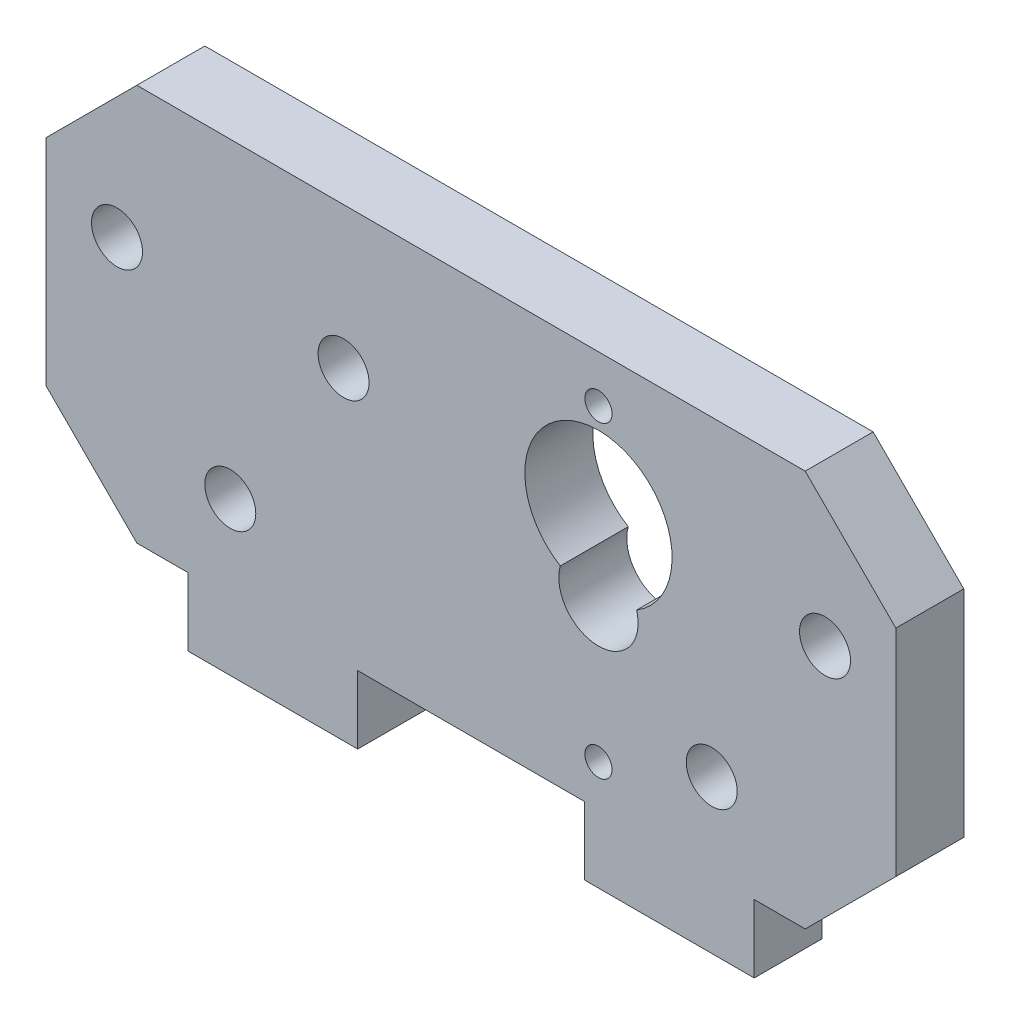
ISO-10303-21;
HEADER;
FILE_DESCRIPTION(('STEP AP214'),'2;1');
FILE_NAME('part.step','',(''),(''),'','','');
FILE_SCHEMA(('AUTOMOTIVE_DESIGN { 1 0 10303 214 1 1 1 1 }'));
ENDSEC;
DATA;
#1=APPLICATION_CONTEXT('core data for automotive mechanical design processes');
#2=APPLICATION_PROTOCOL_DEFINITION('international standard','automotive_design',2000,#1);
#3=PRODUCT_CONTEXT('',#1,'mechanical');
#4=PRODUCT('Part','Part','',(#3));
#5=PRODUCT_RELATED_PRODUCT_CATEGORY('part','',(#4));
#6=PRODUCT_DEFINITION_FORMATION('','',#4);
#7=PRODUCT_DEFINITION_CONTEXT('part definition',#1,'design');
#8=PRODUCT_DEFINITION('design','',#6,#7);
#9=PRODUCT_DEFINITION_SHAPE('','',#8);
#10=(LENGTH_UNIT() NAMED_UNIT(*) SI_UNIT(.MILLI.,.METRE.));
#11=(NAMED_UNIT(*) PLANE_ANGLE_UNIT() SI_UNIT($,.RADIAN.));
#12=(NAMED_UNIT(*) SI_UNIT($,.STERADIAN.) SOLID_ANGLE_UNIT());
#13=UNCERTAINTY_MEASURE_WITH_UNIT(LENGTH_MEASURE(1.E-05),#10,'distance_accuracy_value','');
#14=(GEOMETRIC_REPRESENTATION_CONTEXT(3) GLOBAL_UNCERTAINTY_ASSIGNED_CONTEXT((#13)) GLOBAL_UNIT_ASSIGNED_CONTEXT((#10,
#11,#12)) REPRESENTATION_CONTEXT('',''));
#15=CARTESIAN_POINT('',(0.,0.,0.));
#16=DIRECTION('',(0.,0.,1.));
#17=DIRECTION('',(1.,0.,0.));
#18=AXIS2_PLACEMENT_3D('',#15,#16,#17);
#19=CARTESIAN_POINT('',(-37.5,-17.5,3.));
#20=DIRECTION('',(0.,1.,0.));
#21=DIRECTION('',(-1.,0.,0.));
#22=AXIS2_PLACEMENT_3D('',#19,#20,#21);
#23=PLANE('',#22);
#24=DIRECTION('',(1.,0.,0.));
#25=VECTOR('',#24,1.);
#26=CARTESIAN_POINT('',(-37.5,-17.5,-3.));
#27=LINE('',#26,#25);
#28=CARTESIAN_POINT('',(-10.,-17.5,-3.));
#29=VERTEX_POINT('',#28);
#30=CARTESIAN_POINT('',(10.,-17.5,-3.));
#31=VERTEX_POINT('',#30);
#32=EDGE_CURVE('E309',#29,#31,#27,.T.);
#33=ORIENTED_EDGE('',*,*,#32,.T.);
#34=DIRECTION('',(0.,0.,1.));
#35=VECTOR('',#34,1.);
#36=CARTESIAN_POINT('',(10.,-17.5,-3.));
#37=LINE('',#36,#35);
#38=CARTESIAN_POINT('',(10.,-17.5,3.));
#39=VERTEX_POINT('',#38);
#40=EDGE_CURVE('E188',#31,#39,#37,.T.);
#41=ORIENTED_EDGE('',*,*,#40,.T.);
#42=DIRECTION('',(1.,0.,0.));
#43=VECTOR('',#42,1.);
#44=CARTESIAN_POINT('',(-37.5,-17.5,3.));
#45=LINE('',#44,#43);
#46=CARTESIAN_POINT('',(-10.,-17.5,3.));
#47=VERTEX_POINT('',#46);
#48=EDGE_CURVE('E297',#47,#39,#45,.T.);
#49=ORIENTED_EDGE('',*,*,#48,.F.);
#50=DIRECTION('',(0.,0.,1.));
#51=VECTOR('',#50,1.);
#52=CARTESIAN_POINT('',(-10.,-17.5,-3.));
#53=LINE('',#52,#51);
#54=EDGE_CURVE('E225',#29,#47,#53,.T.);
#55=ORIENTED_EDGE('',*,*,#54,.F.);
#56=EDGE_LOOP('',(#33,#41,#49,#55));
#57=FACE_BOUND('',#56,.T.);
#58=ADVANCED_FACE('F36',(#57),#23,.F.);
#59=CARTESIAN_POINT('',(25.,-17.5,-3.));
#60=VERTEX_POINT('',#59);
#61=CARTESIAN_POINT('',(29.5,-17.5,-3.));
#62=VERTEX_POINT('',#61);
#63=EDGE_CURVE('E305',#60,#62,#27,.T.);
#64=ORIENTED_EDGE('',*,*,#63,.T.);
#65=DIRECTION('',(0.,0.,1.));
#66=VECTOR('',#65,1.);
#67=CARTESIAN_POINT('',(29.5,-17.5,3.));
#68=LINE('',#67,#66);
#69=CARTESIAN_POINT('',(29.5,-17.5,3.));
#70=VERTEX_POINT('',#69);
#71=EDGE_CURVE('E44',#62,#70,#68,.T.);
#72=ORIENTED_EDGE('',*,*,#71,.T.);
#73=CARTESIAN_POINT('',(25.,-17.5,3.));
#74=VERTEX_POINT('',#73);
#75=EDGE_CURVE('E292',#74,#70,#45,.T.);
#76=ORIENTED_EDGE('',*,*,#75,.F.);
#77=DIRECTION('',(0.,0.,1.));
#78=VECTOR('',#77,1.);
#79=CARTESIAN_POINT('',(25.,-17.5,-3.));
#80=LINE('',#79,#78);
#81=EDGE_CURVE('E200',#60,#74,#80,.T.);
#82=ORIENTED_EDGE('',*,*,#81,.F.);
#83=EDGE_LOOP('',(#64,#72,#76,#82));
#84=FACE_BOUND('',#83,.T.);
#85=ADVANCED_FACE('F343',(#84),#23,.F.);
#86=CARTESIAN_POINT('',(0.,0.,3.));
#87=DIRECTION('',(0.,0.,1.));
#88=DIRECTION('',(1.,0.,0.));
#89=AXIS2_PLACEMENT_3D('',#86,#87,#88);
#90=PLANE('',#89);
#91=CARTESIAN_POINT('',(11.25,13.35,3.));
#92=DIRECTION('',(0.,0.,1.));
#93=DIRECTION('',(1.,0.,0.));
#94=AXIS2_PLACEMENT_3D('',#91,#92,#93);
#95=CIRCLE('',#94,1.2);
#96=CARTESIAN_POINT('',(12.45,13.35,3.));
#97=VERTEX_POINT('',#96);
#98=EDGE_CURVE('E224',#97,#97,#95,.T.);
#99=ORIENTED_EDGE('',*,*,#98,.F.);
#100=EDGE_LOOP('',(#99));
#101=FACE_BOUND('',#100,.T.);
#102=CARTESIAN_POINT('',(11.25,-13.85,3.));
#103=DIRECTION('',(0.,0.,1.));
#104=DIRECTION('',(1.,0.,0.));
#105=AXIS2_PLACEMENT_3D('',#102,#103,#104);
#106=CIRCLE('',#105,1.2);
#107=CARTESIAN_POINT('',(12.45,-13.85,3.));
#108=VERTEX_POINT('',#107);
#109=EDGE_CURVE('E235',#108,#108,#106,.T.);
#110=ORIENTED_EDGE('',*,*,#109,.F.);
#111=EDGE_LOOP('',(#110));
#112=FACE_BOUND('',#111,.T.);
#113=CARTESIAN_POINT('',(-31.25,5.,3.));
#114=DIRECTION('',(0.,0.,1.));
#115=DIRECTION('',(1.,0.,0.));
#116=AXIS2_PLACEMENT_3D('',#113,#114,#115);
#117=CIRCLE('',#116,2.24999999999999);
#118=CARTESIAN_POINT('',(-29.,5.,3.));
#119=VERTEX_POINT('',#118);
#120=EDGE_CURVE('E241',#119,#119,#117,.T.);
#121=ORIENTED_EDGE('',*,*,#120,.F.);
#122=EDGE_LOOP('',(#121));
#123=FACE_BOUND('',#122,.T.);
#124=CARTESIAN_POINT('',(31.25,5.,3.));
#125=DIRECTION('',(0.,0.,1.));
#126=DIRECTION('',(1.,0.,0.));
#127=AXIS2_PLACEMENT_3D('',#124,#125,#126);
#128=CIRCLE('',#127,2.24999999999999);
#129=CARTESIAN_POINT('',(33.5,5.,3.));
#130=VERTEX_POINT('',#129);
#131=EDGE_CURVE('E247',#130,#130,#128,.T.);
#132=ORIENTED_EDGE('',*,*,#131,.F.);
#133=EDGE_LOOP('',(#132));
#134=FACE_BOUND('',#133,.T.);
#135=CARTESIAN_POINT('',(21.25,-10.,3.));
#136=DIRECTION('',(0.,0.,1.));
#137=DIRECTION('',(1.,0.,0.));
#138=AXIS2_PLACEMENT_3D('',#135,#136,#137);
#139=CIRCLE('',#138,2.24999999999999);
#140=CARTESIAN_POINT('',(23.5,-10.,3.));
#141=VERTEX_POINT('',#140);
#142=EDGE_CURVE('E253',#141,#141,#139,.T.);
#143=ORIENTED_EDGE('',*,*,#142,.F.);
#144=EDGE_LOOP('',(#143));
#145=FACE_BOUND('',#144,.T.);
#146=CARTESIAN_POINT('',(-21.25,-10.,3.));
#147=DIRECTION('',(0.,0.,1.));
#148=DIRECTION('',(1.,0.,0.));
#149=AXIS2_PLACEMENT_3D('',#146,#147,#148);
#150=CIRCLE('',#149,2.24999999999999);
#151=CARTESIAN_POINT('',(-19.,-10.,3.));
#152=VERTEX_POINT('',#151);
#153=EDGE_CURVE('E259',#152,#152,#150,.T.);
#154=ORIENTED_EDGE('',*,*,#153,.F.);
#155=EDGE_LOOP('',(#154));
#156=FACE_BOUND('',#155,.T.);
#157=DIRECTION('',(-1.,0.,0.));
#158=VECTOR('',#157,1.);
#159=CARTESIAN_POINT('',(-37.5,17.5,3.));
#160=LINE('',#159,#158);
#161=CARTESIAN_POINT('',(29.5,17.5,3.));
#162=VERTEX_POINT('',#161);
#163=CARTESIAN_POINT('',(-29.5,17.5,3.));
#164=VERTEX_POINT('',#163);
#165=EDGE_CURVE('E299',#162,#164,#160,.T.);
#166=ORIENTED_EDGE('',*,*,#165,.T.);
#167=DIRECTION('',(0.707106781186548,0.707106781186548,0.));
#168=VECTOR('',#167,1.);
#169=CARTESIAN_POINT('',(-23.5,23.5,3.));
#170=LINE('',#169,#168);
#171=CARTESIAN_POINT('',(-37.5,9.50000000000001,3.));
#172=VERTEX_POINT('',#171);
#173=EDGE_CURVE('E335',#164,#172,#170,.F.);
#174=ORIENTED_EDGE('',*,*,#173,.T.);
#175=DIRECTION('',(0.,-1.,0.));
#176=VECTOR('',#175,1.);
#177=CARTESIAN_POINT('',(-37.5,17.5,3.));
#178=LINE('',#177,#176);
#179=CARTESIAN_POINT('',(-37.5,-9.50000000000001,3.));
#180=VERTEX_POINT('',#179);
#181=EDGE_CURVE('E289',#172,#180,#178,.T.);
#182=ORIENTED_EDGE('',*,*,#181,.T.);
#183=DIRECTION('',(-0.707106781186548,0.707106781186548,0.));
#184=VECTOR('',#183,1.);
#185=CARTESIAN_POINT('',(-23.5,-23.5,3.));
#186=LINE('',#185,#184);
#187=CARTESIAN_POINT('',(-29.5,-17.5,3.));
#188=VERTEX_POINT('',#187);
#189=EDGE_CURVE('E330',#180,#188,#186,.F.);
#190=ORIENTED_EDGE('',*,*,#189,.T.);
#191=CARTESIAN_POINT('',(-25.,-17.5,3.));
#192=VERTEX_POINT('',#191);
#193=EDGE_CURVE('E294',#188,#192,#45,.T.);
#194=ORIENTED_EDGE('',*,*,#193,.T.);
#195=DIRECTION('',(0.,-1.,0.));
#196=VECTOR('',#195,1.);
#197=CARTESIAN_POINT('',(-25.,-17.5,3.));
#198=LINE('',#197,#196);
#199=CARTESIAN_POINT('',(-25.,-23.5,3.));
#200=VERTEX_POINT('',#199);
#201=EDGE_CURVE('E199',#192,#200,#198,.T.);
#202=ORIENTED_EDGE('',*,*,#201,.T.);
#203=DIRECTION('',(1.,0.,0.));
#204=VECTOR('',#203,1.);
#205=CARTESIAN_POINT('',(-25.,-23.5,3.));
#206=LINE('',#205,#204);
#207=CARTESIAN_POINT('',(-10.,-23.5,3.));
#208=VERTEX_POINT('',#207);
#209=EDGE_CURVE('E216',#200,#208,#206,.T.);
#210=ORIENTED_EDGE('',*,*,#209,.T.);
#211=DIRECTION('',(0.,1.,0.));
#212=VECTOR('',#211,1.);
#213=CARTESIAN_POINT('',(-10.,-17.5,3.));
#214=LINE('',#213,#212);
#215=EDGE_CURVE('E208',#208,#47,#214,.T.);
#216=ORIENTED_EDGE('',*,*,#215,.T.);
#217=ORIENTED_EDGE('',*,*,#48,.T.);
#218=DIRECTION('',(0.,-1.,0.));
#219=VECTOR('',#218,1.);
#220=CARTESIAN_POINT('',(10.,-17.5,3.));
#221=LINE('',#220,#219);
#222=CARTESIAN_POINT('',(10.,-23.5,3.));
#223=VERTEX_POINT('',#222);
#224=EDGE_CURVE('E195',#39,#223,#221,.T.);
#225=ORIENTED_EDGE('',*,*,#224,.T.);
#226=DIRECTION('',(1.,0.,0.));
#227=VECTOR('',#226,1.);
#228=CARTESIAN_POINT('',(10.,-23.5,3.));
#229=LINE('',#228,#227);
#230=CARTESIAN_POINT('',(25.,-23.5,3.));
#231=VERTEX_POINT('',#230);
#232=EDGE_CURVE('E168',#223,#231,#229,.T.);
#233=ORIENTED_EDGE('',*,*,#232,.T.);
#234=DIRECTION('',(0.,1.,0.));
#235=VECTOR('',#234,1.);
#236=CARTESIAN_POINT('',(25.,-17.5,3.));
#237=LINE('',#236,#235);
#238=EDGE_CURVE('E189',#231,#74,#237,.T.);
#239=ORIENTED_EDGE('',*,*,#238,.T.);
#240=ORIENTED_EDGE('',*,*,#75,.T.);
#241=DIRECTION('',(-0.707106781186547,-0.707106781186548,0.));
#242=VECTOR('',#241,1.);
#243=CARTESIAN_POINT('',(23.5,-23.5,3.));
#244=LINE('',#243,#242);
#245=CARTESIAN_POINT('',(37.5,-9.5,3.));
#246=VERTEX_POINT('',#245);
#247=EDGE_CURVE('E58',#70,#246,#244,.F.);
#248=ORIENTED_EDGE('',*,*,#247,.T.);
#249=DIRECTION('',(0.,1.,0.));
#250=VECTOR('',#249,1.);
#251=CARTESIAN_POINT('',(37.5,17.5,3.));
#252=LINE('',#251,#250);
#253=CARTESIAN_POINT('',(37.5,9.5,3.));
#254=VERTEX_POINT('',#253);
#255=EDGE_CURVE('E296',#246,#254,#252,.T.);
#256=ORIENTED_EDGE('',*,*,#255,.T.);
#257=DIRECTION('',(0.707106781186547,-0.707106781186548,0.));
#258=VECTOR('',#257,1.);
#259=CARTESIAN_POINT('',(23.5,23.5,3.));
#260=LINE('',#259,#258);
#261=EDGE_CURVE('E333',#254,#162,#260,.F.);
#262=ORIENTED_EDGE('',*,*,#261,.T.);
#263=EDGE_LOOP('',(#166,#174,#182,#190,#194,#202,#210,#216,#217,#225,#233,#239,#240,#248,#256,#262));
#264=FACE_BOUND('',#263,.T.);
#265=CARTESIAN_POINT('',(-11.25,5.,3.));
#266=DIRECTION('',(0.,0.,1.));
#267=DIRECTION('',(1.,0.,0.));
#268=AXIS2_PLACEMENT_3D('',#265,#266,#267);
#269=CIRCLE('',#268,2.25);
#270=CARTESIAN_POINT('',(-9.,5.,3.));
#271=VERTEX_POINT('',#270);
#272=EDGE_CURVE('E283',#271,#271,#269,.T.);
#273=ORIENTED_EDGE('',*,*,#272,.F.);
#274=EDGE_LOOP('',(#273));
#275=FACE_BOUND('',#274,.T.);
#276=CARTESIAN_POINT('',(11.25,5.,3.));
#277=DIRECTION('',(0.,0.,1.));
#278=DIRECTION('',(1.,0.,0.));
#279=AXIS2_PLACEMENT_3D('',#276,#277,#278);
#280=CIRCLE('',#279,6.5);
#281=CARTESIAN_POINT('',(14.6207649299555,-0.557692307692307,3.));
#282=VERTEX_POINT('',#281);
#283=CARTESIAN_POINT('',(7.87923507004452,-0.557692307692305,3.));
#284=VERTEX_POINT('',#283);
#285=EDGE_CURVE('E269',#282,#284,#280,.T.);
#286=ORIENTED_EDGE('',*,*,#285,.F.);
#287=CARTESIAN_POINT('',(11.25,-1.5,3.));
#288=DIRECTION('',(0.,0.,1.));
#289=DIRECTION('',(1.,0.,0.));
#290=AXIS2_PLACEMENT_3D('',#287,#288,#289);
#291=CIRCLE('',#290,3.5);
#292=EDGE_CURVE('E266',#284,#282,#291,.T.);
#293=ORIENTED_EDGE('',*,*,#292,.F.);
#294=EDGE_LOOP('',(#286,#293));
#295=FACE_BOUND('',#294,.T.);
#296=ADVANCED_FACE('F346',(#101,#112,#123,#134,#145,#156,#264,#275,#295),#90,.T.);
#297=CARTESIAN_POINT('',(0.,0.,-3.));
#298=DIRECTION('',(0.,0.,1.));
#299=DIRECTION('',(1.,0.,0.));
#300=AXIS2_PLACEMENT_3D('',#297,#298,#299);
#301=PLANE('',#300);
#302=CARTESIAN_POINT('',(11.25,13.35,-3.));
#303=DIRECTION('',(0.,0.,1.));
#304=DIRECTION('',(1.,0.,0.));
#305=AXIS2_PLACEMENT_3D('',#302,#303,#304);
#306=CIRCLE('',#305,1.2);
#307=CARTESIAN_POINT('',(12.45,13.35,-3.));
#308=VERTEX_POINT('',#307);
#309=EDGE_CURVE('E232',#308,#308,#306,.T.);
#310=ORIENTED_EDGE('',*,*,#309,.T.);
#311=EDGE_LOOP('',(#310));
#312=FACE_BOUND('',#311,.T.);
#313=CARTESIAN_POINT('',(11.25,-13.85,-3.));
#314=DIRECTION('',(0.,0.,1.));
#315=DIRECTION('',(1.,0.,0.));
#316=AXIS2_PLACEMENT_3D('',#313,#314,#315);
#317=CIRCLE('',#316,1.2);
#318=CARTESIAN_POINT('',(12.45,-13.85,-3.));
#319=VERTEX_POINT('',#318);
#320=EDGE_CURVE('E238',#319,#319,#317,.T.);
#321=ORIENTED_EDGE('',*,*,#320,.T.);
#322=EDGE_LOOP('',(#321));
#323=FACE_BOUND('',#322,.T.);
#324=CARTESIAN_POINT('',(-31.25,5.,-3.));
#325=DIRECTION('',(0.,0.,1.));
#326=DIRECTION('',(1.,0.,0.));
#327=AXIS2_PLACEMENT_3D('',#324,#325,#326);
#328=CIRCLE('',#327,2.24999999999999);
#329=CARTESIAN_POINT('',(-29.,5.,-3.));
#330=VERTEX_POINT('',#329);
#331=EDGE_CURVE('E244',#330,#330,#328,.T.);
#332=ORIENTED_EDGE('',*,*,#331,.T.);
#333=EDGE_LOOP('',(#332));
#334=FACE_BOUND('',#333,.T.);
#335=CARTESIAN_POINT('',(31.25,5.,-3.));
#336=DIRECTION('',(0.,0.,1.));
#337=DIRECTION('',(1.,0.,0.));
#338=AXIS2_PLACEMENT_3D('',#335,#336,#337);
#339=CIRCLE('',#338,2.25);
#340=CARTESIAN_POINT('',(33.5,5.,-3.));
#341=VERTEX_POINT('',#340);
#342=EDGE_CURVE('E250',#341,#341,#339,.T.);
#343=ORIENTED_EDGE('',*,*,#342,.T.);
#344=EDGE_LOOP('',(#343));
#345=FACE_BOUND('',#344,.T.);
#346=CARTESIAN_POINT('',(21.25,-10.,-3.));
#347=DIRECTION('',(0.,0.,1.));
#348=DIRECTION('',(1.,0.,0.));
#349=AXIS2_PLACEMENT_3D('',#346,#347,#348);
#350=CIRCLE('',#349,2.24999999999999);
#351=CARTESIAN_POINT('',(23.5,-10.,-3.));
#352=VERTEX_POINT('',#351);
#353=EDGE_CURVE('E256',#352,#352,#350,.T.);
#354=ORIENTED_EDGE('',*,*,#353,.T.);
#355=EDGE_LOOP('',(#354));
#356=FACE_BOUND('',#355,.T.);
#357=CARTESIAN_POINT('',(-21.25,-10.,-3.));
#358=DIRECTION('',(0.,0.,1.));
#359=DIRECTION('',(1.,0.,0.));
#360=AXIS2_PLACEMENT_3D('',#357,#358,#359);
#361=CIRCLE('',#360,2.24999999999999);
#362=CARTESIAN_POINT('',(-19.,-10.,-3.));
#363=VERTEX_POINT('',#362);
#364=EDGE_CURVE('E262',#363,#363,#361,.T.);
#365=ORIENTED_EDGE('',*,*,#364,.T.);
#366=EDGE_LOOP('',(#365));
#367=FACE_BOUND('',#366,.T.);
#368=CARTESIAN_POINT('',(-11.25,5.,-3.));
#369=DIRECTION('',(0.,0.,1.));
#370=DIRECTION('',(1.,0.,0.));
#371=AXIS2_PLACEMENT_3D('',#368,#369,#370);
#372=CIRCLE('',#371,2.25);
#373=CARTESIAN_POINT('',(-9.,5.,-3.));
#374=VERTEX_POINT('',#373);
#375=EDGE_CURVE('E282',#374,#374,#372,.T.);
#376=ORIENTED_EDGE('',*,*,#375,.T.);
#377=EDGE_LOOP('',(#376));
#378=FACE_BOUND('',#377,.T.);
#379=DIRECTION('',(0.,-1.,0.));
#380=VECTOR('',#379,1.);
#381=CARTESIAN_POINT('',(-37.5,17.5,-3.));
#382=LINE('',#381,#380);
#383=CARTESIAN_POINT('',(-37.5,9.50000000000001,-3.));
#384=VERTEX_POINT('',#383);
#385=CARTESIAN_POINT('',(-37.5,-9.50000000000001,-3.));
#386=VERTEX_POINT('',#385);
#387=EDGE_CURVE('E286',#384,#386,#382,.T.);
#388=ORIENTED_EDGE('',*,*,#387,.F.);
#389=DIRECTION('',(-0.707106781186548,-0.707106781186548,0.));
#390=VECTOR('',#389,1.);
#391=CARTESIAN_POINT('',(-37.5,9.50000000000001,-3.));
#392=LINE('',#391,#390);
#393=CARTESIAN_POINT('',(-29.5,17.5,-3.));
#394=VERTEX_POINT('',#393);
#395=EDGE_CURVE('E323',#384,#394,#392,.F.);
#396=ORIENTED_EDGE('',*,*,#395,.T.);
#397=DIRECTION('',(-1.,0.,0.));
#398=VECTOR('',#397,1.);
#399=CARTESIAN_POINT('',(-37.5,17.5,-3.));
#400=LINE('',#399,#398);
#401=CARTESIAN_POINT('',(29.5,17.5,-3.));
#402=VERTEX_POINT('',#401);
#403=EDGE_CURVE('E293',#402,#394,#400,.T.);
#404=ORIENTED_EDGE('',*,*,#403,.F.);
#405=DIRECTION('',(-0.707106781186547,0.707106781186548,0.));
#406=VECTOR('',#405,1.);
#407=CARTESIAN_POINT('',(29.5,17.5,-3.));
#408=LINE('',#407,#406);
#409=CARTESIAN_POINT('',(37.5,9.5,-3.));
#410=VERTEX_POINT('',#409);
#411=EDGE_CURVE('E321',#402,#410,#408,.F.);
#412=ORIENTED_EDGE('',*,*,#411,.T.);
#413=DIRECTION('',(0.,1.,0.));
#414=VECTOR('',#413,1.);
#415=CARTESIAN_POINT('',(37.5,17.5,-3.));
#416=LINE('',#415,#414);
#417=CARTESIAN_POINT('',(37.5,-9.5,-3.));
#418=VERTEX_POINT('',#417);
#419=EDGE_CURVE('E308',#418,#410,#416,.T.);
#420=ORIENTED_EDGE('',*,*,#419,.F.);
#421=DIRECTION('',(0.707106781186547,0.707106781186548,0.));
#422=VECTOR('',#421,1.);
#423=CARTESIAN_POINT('',(37.5,-9.5,-3.));
#424=LINE('',#423,#422);
#425=EDGE_CURVE('E319',#418,#62,#424,.F.);
#426=ORIENTED_EDGE('',*,*,#425,.T.);
#427=ORIENTED_EDGE('',*,*,#63,.F.);
#428=DIRECTION('',(0.,1.,0.));
#429=VECTOR('',#428,1.);
#430=CARTESIAN_POINT('',(25.,-17.5,-3.));
#431=LINE('',#430,#429);
#432=CARTESIAN_POINT('',(25.,-23.5,-3.));
#433=VERTEX_POINT('',#432);
#434=EDGE_CURVE('E174',#433,#60,#431,.T.);
#435=ORIENTED_EDGE('',*,*,#434,.F.);
#436=DIRECTION('',(1.,0.,0.));
#437=VECTOR('',#436,1.);
#438=CARTESIAN_POINT('',(10.,-23.5,-3.));
#439=LINE('',#438,#437);
#440=CARTESIAN_POINT('',(10.,-23.5,-3.));
#441=VERTEX_POINT('',#440);
#442=EDGE_CURVE('E166',#441,#433,#439,.T.);
#443=ORIENTED_EDGE('',*,*,#442,.F.);
#444=DIRECTION('',(0.,-1.,0.));
#445=VECTOR('',#444,1.);
#446=CARTESIAN_POINT('',(10.,-17.5,-3.));
#447=LINE('',#446,#445);
#448=EDGE_CURVE('E183',#31,#441,#447,.T.);
#449=ORIENTED_EDGE('',*,*,#448,.F.);
#450=ORIENTED_EDGE('',*,*,#32,.F.);
#451=DIRECTION('',(0.,1.,0.));
#452=VECTOR('',#451,1.);
#453=CARTESIAN_POINT('',(-10.,-17.5,-3.));
#454=LINE('',#453,#452);
#455=CARTESIAN_POINT('',(-10.,-23.5,-3.));
#456=VERTEX_POINT('',#455);
#457=EDGE_CURVE('E211',#456,#29,#454,.T.);
#458=ORIENTED_EDGE('',*,*,#457,.F.);
#459=DIRECTION('',(1.,0.,0.));
#460=VECTOR('',#459,1.);
#461=CARTESIAN_POINT('',(-25.,-23.5,-3.));
#462=LINE('',#461,#460);
#463=CARTESIAN_POINT('',(-25.,-23.5,-3.));
#464=VERTEX_POINT('',#463);
#465=EDGE_CURVE('E207',#464,#456,#462,.T.);
#466=ORIENTED_EDGE('',*,*,#465,.F.);
#467=DIRECTION('',(0.,-1.,0.));
#468=VECTOR('',#467,1.);
#469=CARTESIAN_POINT('',(-25.,-17.5,-3.));
#470=LINE('',#469,#468);
#471=CARTESIAN_POINT('',(-25.,-17.5,-3.));
#472=VERTEX_POINT('',#471);
#473=EDGE_CURVE('E204',#472,#464,#470,.T.);
#474=ORIENTED_EDGE('',*,*,#473,.F.);
#475=CARTESIAN_POINT('',(-29.5,-17.5,-3.));
#476=VERTEX_POINT('',#475);
#477=EDGE_CURVE('E306',#476,#472,#27,.T.);
#478=ORIENTED_EDGE('',*,*,#477,.F.);
#479=DIRECTION('',(0.707106781186548,-0.707106781186548,0.));
#480=VECTOR('',#479,1.);
#481=CARTESIAN_POINT('',(-29.5,-17.5,-3.));
#482=LINE('',#481,#480);
#483=EDGE_CURVE('E317',#476,#386,#482,.F.);
#484=ORIENTED_EDGE('',*,*,#483,.T.);
#485=EDGE_LOOP('',(#388,#396,#404,#412,#420,#426,#427,#435,#443,#449,#450,#458,#466,#474,#478,#484));
#486=FACE_BOUND('',#485,.T.);
#487=CARTESIAN_POINT('',(11.25,-1.5,-3.));
#488=DIRECTION('',(0.,0.,1.));
#489=DIRECTION('',(1.,0.,0.));
#490=AXIS2_PLACEMENT_3D('',#487,#488,#489);
#491=CIRCLE('',#490,3.5);
#492=CARTESIAN_POINT('',(7.87923507004452,-0.557692307692306,-3.));
#493=VERTEX_POINT('',#492);
#494=CARTESIAN_POINT('',(14.6207649299555,-0.557692307692307,-3.));
#495=VERTEX_POINT('',#494);
#496=EDGE_CURVE('E265',#493,#495,#491,.T.);
#497=ORIENTED_EDGE('',*,*,#496,.T.);
#498=CARTESIAN_POINT('',(11.25,5.,-3.));
#499=DIRECTION('',(0.,0.,1.));
#500=DIRECTION('',(1.,0.,0.));
#501=AXIS2_PLACEMENT_3D('',#498,#499,#500);
#502=CIRCLE('',#501,6.5);
#503=EDGE_CURVE('E270',#495,#493,#502,.T.);
#504=ORIENTED_EDGE('',*,*,#503,.T.);
#505=EDGE_LOOP('',(#497,#504));
#506=FACE_BOUND('',#505,.T.);
#507=ADVANCED_FACE('F180',(#312,#323,#334,#345,#356,#367,#378,#486,#506),#301,.F.);
#508=CARTESIAN_POINT('',(-37.5,17.5,3.));
#509=DIRECTION('',(1.,0.,0.));
#510=DIRECTION('',(0.,0.,-1.));
#511=AXIS2_PLACEMENT_3D('',#508,#509,#510);
#512=PLANE('',#511);
#513=ORIENTED_EDGE('',*,*,#181,.F.);
#514=DIRECTION('',(0.,0.,-1.));
#515=VECTOR('',#514,1.);
#516=CARTESIAN_POINT('',(-37.5,9.50000000000001,3.));
#517=LINE('',#516,#515);
#518=EDGE_CURVE('E314',#172,#384,#517,.T.);
#519=ORIENTED_EDGE('',*,*,#518,.T.);
#520=ORIENTED_EDGE('',*,*,#387,.T.);
#521=DIRECTION('',(0.,0.,1.));
#522=VECTOR('',#521,1.);
#523=CARTESIAN_POINT('',(-37.5,-9.50000000000001,3.));
#524=LINE('',#523,#522);
#525=EDGE_CURVE('E302',#386,#180,#524,.T.);
#526=ORIENTED_EDGE('',*,*,#525,.T.);
#527=EDGE_LOOP('',(#513,#519,#520,#526));
#528=FACE_BOUND('',#527,.T.);
#529=ADVANCED_FACE('F368',(#528),#512,.F.);
#530=ORIENTED_EDGE('',*,*,#193,.F.);
#531=DIRECTION('',(0.,0.,-1.));
#532=VECTOR('',#531,1.);
#533=CARTESIAN_POINT('',(-29.5,-17.5,3.));
#534=LINE('',#533,#532);
#535=EDGE_CURVE('E13',#188,#476,#534,.T.);
#536=ORIENTED_EDGE('',*,*,#535,.T.);
#537=ORIENTED_EDGE('',*,*,#477,.T.);
#538=DIRECTION('',(0.,0.,1.));
#539=VECTOR('',#538,1.);
#540=CARTESIAN_POINT('',(-25.,-17.5,-3.));
#541=LINE('',#540,#539);
#542=EDGE_CURVE('E221',#472,#192,#541,.T.);
#543=ORIENTED_EDGE('',*,*,#542,.T.);
#544=EDGE_LOOP('',(#530,#536,#537,#543));
#545=FACE_BOUND('',#544,.T.);
#546=ADVANCED_FACE('F377',(#545),#23,.F.);
#547=CARTESIAN_POINT('',(37.5,17.5,3.));
#548=DIRECTION('',(-1.,0.,0.));
#549=DIRECTION('',(0.,0.,1.));
#550=AXIS2_PLACEMENT_3D('',#547,#548,#549);
#551=PLANE('',#550);
#552=ORIENTED_EDGE('',*,*,#419,.T.);
#553=DIRECTION('',(0.,0.,1.));
#554=VECTOR('',#553,1.);
#555=CARTESIAN_POINT('',(37.5,9.5,3.));
#556=LINE('',#555,#554);
#557=EDGE_CURVE('E51',#410,#254,#556,.T.);
#558=ORIENTED_EDGE('',*,*,#557,.T.);
#559=ORIENTED_EDGE('',*,*,#255,.F.);
#560=DIRECTION('',(0.,0.,-1.));
#561=VECTOR('',#560,1.);
#562=CARTESIAN_POINT('',(37.5,-9.5,3.));
#563=LINE('',#562,#561);
#564=EDGE_CURVE('E337',#246,#418,#563,.T.);
#565=ORIENTED_EDGE('',*,*,#564,.T.);
#566=EDGE_LOOP('',(#552,#558,#559,#565));
#567=FACE_BOUND('',#566,.T.);
#568=ADVANCED_FACE('F352',(#567),#551,.F.);
#569=CARTESIAN_POINT('',(-37.5,17.5,3.));
#570=DIRECTION('',(0.,-1.,0.));
#571=DIRECTION('',(1.,0.,0.));
#572=AXIS2_PLACEMENT_3D('',#569,#570,#571);
#573=PLANE('',#572);
#574=ORIENTED_EDGE('',*,*,#403,.T.);
#575=DIRECTION('',(0.,0.,1.));
#576=VECTOR('',#575,1.);
#577=CARTESIAN_POINT('',(-29.5,17.5,3.));
#578=LINE('',#577,#576);
#579=EDGE_CURVE('E328',#394,#164,#578,.T.);
#580=ORIENTED_EDGE('',*,*,#579,.T.);
#581=ORIENTED_EDGE('',*,*,#165,.F.);
#582=DIRECTION('',(0.,0.,-1.));
#583=VECTOR('',#582,1.);
#584=CARTESIAN_POINT('',(29.5,17.5,3.));
#585=LINE('',#584,#583);
#586=EDGE_CURVE('E325',#162,#402,#585,.T.);
#587=ORIENTED_EDGE('',*,*,#586,.T.);
#588=EDGE_LOOP('',(#574,#580,#581,#587));
#589=FACE_BOUND('',#588,.T.);
#590=ADVANCED_FACE('F360',(#589),#573,.F.);
#591=CARTESIAN_POINT('',(-11.25,5.,3.));
#592=DIRECTION('',(0.,0.,-1.));
#593=DIRECTION('',(-1.,0.,0.));
#594=AXIS2_PLACEMENT_3D('',#591,#592,#593);
#595=CYLINDRICAL_SURFACE('',#594,2.25);
#596=ORIENTED_EDGE('',*,*,#272,.T.);
#597=EDGE_LOOP('',(#596));
#598=FACE_BOUND('',#597,.T.);
#599=ORIENTED_EDGE('',*,*,#375,.F.);
#600=EDGE_LOOP('',(#599));
#601=FACE_BOUND('',#600,.T.);
#602=ADVANCED_FACE('F458',(#598,#601),#595,.F.);
#603=CARTESIAN_POINT('',(11.25,-1.5,3.));
#604=DIRECTION('',(0.,0.,-1.));
#605=DIRECTION('',(-1.,0.,0.));
#606=AXIS2_PLACEMENT_3D('',#603,#604,#605);
#607=CYLINDRICAL_SURFACE('',#606,3.5);
#608=ORIENTED_EDGE('',*,*,#496,.F.);
#609=DIRECTION('',(0.,0.,-1.));
#610=VECTOR('',#609,1.);
#611=CARTESIAN_POINT('',(7.87923507004452,-0.557692307692305,3.));
#612=LINE('',#611,#610);
#613=EDGE_CURVE('E272',#284,#493,#612,.T.);
#614=ORIENTED_EDGE('',*,*,#613,.F.);
#615=ORIENTED_EDGE('',*,*,#292,.T.);
#616=DIRECTION('',(0.,0.,-1.));
#617=VECTOR('',#616,1.);
#618=CARTESIAN_POINT('',(14.6207649299555,-0.557692307692307,3.));
#619=LINE('',#618,#617);
#620=EDGE_CURVE('E279',#282,#495,#619,.T.);
#621=ORIENTED_EDGE('',*,*,#620,.T.);
#622=EDGE_LOOP('',(#608,#614,#615,#621));
#623=FACE_BOUND('',#622,.T.);
#624=ADVANCED_FACE('F610',(#623),#607,.F.);
#625=CARTESIAN_POINT('',(11.25,5.,3.));
#626=DIRECTION('',(0.,0.,-1.));
#627=DIRECTION('',(-1.,0.,0.));
#628=AXIS2_PLACEMENT_3D('',#625,#626,#627);
#629=CYLINDRICAL_SURFACE('',#628,6.5);
#630=ORIENTED_EDGE('',*,*,#503,.F.);
#631=ORIENTED_EDGE('',*,*,#620,.F.);
#632=ORIENTED_EDGE('',*,*,#285,.T.);
#633=ORIENTED_EDGE('',*,*,#613,.T.);
#634=EDGE_LOOP('',(#630,#631,#632,#633));
#635=FACE_BOUND('',#634,.T.);
#636=ADVANCED_FACE('F600',(#635),#629,.F.);
#637=CARTESIAN_POINT('',(-21.25,-10.,3.));
#638=DIRECTION('',(0.,0.,1.));
#639=DIRECTION('',(1.,0.,0.));
#640=AXIS2_PLACEMENT_3D('',#637,#638,#639);
#641=CYLINDRICAL_SURFACE('',#640,2.24999999999999);
#642=ORIENTED_EDGE('',*,*,#364,.F.);
#643=EDGE_LOOP('',(#642));
#644=FACE_BOUND('',#643,.T.);
#645=ORIENTED_EDGE('',*,*,#153,.T.);
#646=EDGE_LOOP('',(#645));
#647=FACE_BOUND('',#646,.T.);
#648=ADVANCED_FACE('F590',(#644,#647),#641,.F.);
#649=CARTESIAN_POINT('',(21.25,-10.,3.));
#650=DIRECTION('',(0.,0.,1.));
#651=DIRECTION('',(1.,0.,0.));
#652=AXIS2_PLACEMENT_3D('',#649,#650,#651);
#653=CYLINDRICAL_SURFACE('',#652,2.24999999999999);
#654=ORIENTED_EDGE('',*,*,#353,.F.);
#655=EDGE_LOOP('',(#654));
#656=FACE_BOUND('',#655,.T.);
#657=ORIENTED_EDGE('',*,*,#142,.T.);
#658=EDGE_LOOP('',(#657));
#659=FACE_BOUND('',#658,.T.);
#660=ADVANCED_FACE('F580',(#656,#659),#653,.F.);
#661=CARTESIAN_POINT('',(31.25,5.,3.));
#662=DIRECTION('',(0.,0.,1.));
#663=DIRECTION('',(1.,0.,0.));
#664=AXIS2_PLACEMENT_3D('',#661,#662,#663);
#665=CYLINDRICAL_SURFACE('',#664,2.25);
#666=ORIENTED_EDGE('',*,*,#342,.F.);
#667=EDGE_LOOP('',(#666));
#668=FACE_BOUND('',#667,.T.);
#669=ORIENTED_EDGE('',*,*,#131,.T.);
#670=EDGE_LOOP('',(#669));
#671=FACE_BOUND('',#670,.T.);
#672=ADVANCED_FACE('F570',(#668,#671),#665,.F.);
#673=CARTESIAN_POINT('',(-31.25,5.,3.));
#674=DIRECTION('',(0.,0.,1.));
#675=DIRECTION('',(1.,0.,0.));
#676=AXIS2_PLACEMENT_3D('',#673,#674,#675);
#677=CYLINDRICAL_SURFACE('',#676,2.24999999999999);
#678=ORIENTED_EDGE('',*,*,#331,.F.);
#679=EDGE_LOOP('',(#678));
#680=FACE_BOUND('',#679,.T.);
#681=ORIENTED_EDGE('',*,*,#120,.T.);
#682=EDGE_LOOP('',(#681));
#683=FACE_BOUND('',#682,.T.);
#684=ADVANCED_FACE('F560',(#680,#683),#677,.F.);
#685=CARTESIAN_POINT('',(11.25,-13.85,3.));
#686=DIRECTION('',(0.,0.,1.));
#687=DIRECTION('',(1.,0.,0.));
#688=AXIS2_PLACEMENT_3D('',#685,#686,#687);
#689=CYLINDRICAL_SURFACE('',#688,1.2);
#690=ORIENTED_EDGE('',*,*,#320,.F.);
#691=EDGE_LOOP('',(#690));
#692=FACE_BOUND('',#691,.T.);
#693=ORIENTED_EDGE('',*,*,#109,.T.);
#694=EDGE_LOOP('',(#693));
#695=FACE_BOUND('',#694,.T.);
#696=ADVANCED_FACE('F550',(#692,#695),#689,.F.);
#697=CARTESIAN_POINT('',(11.25,13.35,3.));
#698=DIRECTION('',(0.,0.,1.));
#699=DIRECTION('',(1.,0.,0.));
#700=AXIS2_PLACEMENT_3D('',#697,#698,#699);
#701=CYLINDRICAL_SURFACE('',#700,1.2);
#702=ORIENTED_EDGE('',*,*,#309,.F.);
#703=EDGE_LOOP('',(#702));
#704=FACE_BOUND('',#703,.T.);
#705=ORIENTED_EDGE('',*,*,#98,.T.);
#706=EDGE_LOOP('',(#705));
#707=FACE_BOUND('',#706,.T.);
#708=ADVANCED_FACE('F401',(#704,#707),#701,.F.);
#709=CARTESIAN_POINT('',(-25.,-17.5,-3.));
#710=DIRECTION('',(-1.,0.,0.));
#711=DIRECTION('',(0.,0.,1.));
#712=AXIS2_PLACEMENT_3D('',#709,#710,#711);
#713=PLANE('',#712);
#714=ORIENTED_EDGE('',*,*,#201,.F.);
#715=ORIENTED_EDGE('',*,*,#542,.F.);
#716=ORIENTED_EDGE('',*,*,#473,.T.);
#717=DIRECTION('',(0.,0.,1.));
#718=VECTOR('',#717,1.);
#719=CARTESIAN_POINT('',(-25.,-23.5,-3.));
#720=LINE('',#719,#718);
#721=EDGE_CURVE('E213',#464,#200,#720,.T.);
#722=ORIENTED_EDGE('',*,*,#721,.T.);
#723=EDGE_LOOP('',(#714,#715,#716,#722));
#724=FACE_BOUND('',#723,.T.);
#725=ADVANCED_FACE('F381',(#724),#713,.T.);
#726=CARTESIAN_POINT('',(-10.,-17.5,-3.));
#727=DIRECTION('',(1.,0.,0.));
#728=DIRECTION('',(0.,0.,-1.));
#729=AXIS2_PLACEMENT_3D('',#726,#727,#728);
#730=PLANE('',#729);
#731=ORIENTED_EDGE('',*,*,#215,.F.);
#732=DIRECTION('',(0.,0.,1.));
#733=VECTOR('',#732,1.);
#734=CARTESIAN_POINT('',(-10.,-23.5,-3.));
#735=LINE('',#734,#733);
#736=EDGE_CURVE('E227',#456,#208,#735,.T.);
#737=ORIENTED_EDGE('',*,*,#736,.F.);
#738=ORIENTED_EDGE('',*,*,#457,.T.);
#739=ORIENTED_EDGE('',*,*,#54,.T.);
#740=EDGE_LOOP('',(#731,#737,#738,#739));
#741=FACE_BOUND('',#740,.T.);
#742=ADVANCED_FACE('F393',(#741),#730,.T.);
#743=CARTESIAN_POINT('',(-25.,-23.5,-3.));
#744=DIRECTION('',(0.,-1.,0.));
#745=DIRECTION('',(1.,0.,0.));
#746=AXIS2_PLACEMENT_3D('',#743,#744,#745);
#747=PLANE('',#746);
#748=ORIENTED_EDGE('',*,*,#209,.F.);
#749=ORIENTED_EDGE('',*,*,#721,.F.);
#750=ORIENTED_EDGE('',*,*,#465,.T.);
#751=ORIENTED_EDGE('',*,*,#736,.T.);
#752=EDGE_LOOP('',(#748,#749,#750,#751));
#753=FACE_BOUND('',#752,.T.);
#754=ADVANCED_FACE('F385',(#753),#747,.T.);
#755=CARTESIAN_POINT('',(10.,-17.5,-3.));
#756=DIRECTION('',(-1.,0.,0.));
#757=DIRECTION('',(0.,0.,1.));
#758=AXIS2_PLACEMENT_3D('',#755,#756,#757);
#759=PLANE('',#758);
#760=ORIENTED_EDGE('',*,*,#224,.F.);
#761=ORIENTED_EDGE('',*,*,#40,.F.);
#762=ORIENTED_EDGE('',*,*,#448,.T.);
#763=DIRECTION('',(0.,0.,1.));
#764=VECTOR('',#763,1.);
#765=CARTESIAN_POINT('',(10.,-23.5,-3.));
#766=LINE('',#765,#764);
#767=EDGE_CURVE('E163',#441,#223,#766,.T.);
#768=ORIENTED_EDGE('',*,*,#767,.T.);
#769=EDGE_LOOP('',(#760,#761,#762,#768));
#770=FACE_BOUND('',#769,.T.);
#771=ADVANCED_FACE('F187',(#770),#759,.T.);
#772=CARTESIAN_POINT('',(25.,-17.5,-3.));
#773=DIRECTION('',(1.,0.,0.));
#774=DIRECTION('',(0.,0.,-1.));
#775=AXIS2_PLACEMENT_3D('',#772,#773,#774);
#776=PLANE('',#775);
#777=ORIENTED_EDGE('',*,*,#238,.F.);
#778=DIRECTION('',(0.,0.,1.));
#779=VECTOR('',#778,1.);
#780=CARTESIAN_POINT('',(25.,-23.5,-3.));
#781=LINE('',#780,#779);
#782=EDGE_CURVE('E173',#433,#231,#781,.T.);
#783=ORIENTED_EDGE('',*,*,#782,.F.);
#784=ORIENTED_EDGE('',*,*,#434,.T.);
#785=ORIENTED_EDGE('',*,*,#81,.T.);
#786=EDGE_LOOP('',(#777,#783,#784,#785));
#787=FACE_BOUND('',#786,.T.);
#788=ADVANCED_FACE('F508',(#787),#776,.T.);
#789=CARTESIAN_POINT('',(10.,-23.5,-3.));
#790=DIRECTION('',(0.,-1.,0.));
#791=DIRECTION('',(1.,0.,0.));
#792=AXIS2_PLACEMENT_3D('',#789,#790,#791);
#793=PLANE('',#792);
#794=ORIENTED_EDGE('',*,*,#232,.F.);
#795=ORIENTED_EDGE('',*,*,#767,.F.);
#796=ORIENTED_EDGE('',*,*,#442,.T.);
#797=ORIENTED_EDGE('',*,*,#782,.T.);
#798=EDGE_LOOP('',(#794,#795,#796,#797));
#799=FACE_BOUND('',#798,.T.);
#800=ADVANCED_FACE('F165',(#799),#793,.T.);
#801=CARTESIAN_POINT('',(-37.5,9.50000000000001,3.));
#802=DIRECTION('',(0.707106781186548,-0.707106781186548,0.));
#803=DIRECTION('',(0.,0.,-1.));
#804=AXIS2_PLACEMENT_3D('',#801,#802,#803);
#805=PLANE('',#804);
#806=ORIENTED_EDGE('',*,*,#173,.F.);
#807=ORIENTED_EDGE('',*,*,#579,.F.);
#808=ORIENTED_EDGE('',*,*,#395,.F.);
#809=ORIENTED_EDGE('',*,*,#518,.F.);
#810=EDGE_LOOP('',(#806,#807,#808,#809));
#811=FACE_BOUND('',#810,.T.);
#812=ADVANCED_FACE('F366',(#811),#805,.F.);
#813=CARTESIAN_POINT('',(29.5,17.5,3.));
#814=DIRECTION('',(-0.707106781186548,-0.707106781186547,0.));
#815=DIRECTION('',(0.,0.,-1.));
#816=AXIS2_PLACEMENT_3D('',#813,#814,#815);
#817=PLANE('',#816);
#818=ORIENTED_EDGE('',*,*,#261,.F.);
#819=ORIENTED_EDGE('',*,*,#557,.F.);
#820=ORIENTED_EDGE('',*,*,#411,.F.);
#821=ORIENTED_EDGE('',*,*,#586,.F.);
#822=EDGE_LOOP('',(#818,#819,#820,#821));
#823=FACE_BOUND('',#822,.T.);
#824=ADVANCED_FACE('F357',(#823),#817,.F.);
#825=CARTESIAN_POINT('',(37.5,-9.5,3.));
#826=DIRECTION('',(-0.707106781186548,0.707106781186547,0.));
#827=DIRECTION('',(0.,0.,-1.));
#828=AXIS2_PLACEMENT_3D('',#825,#826,#827);
#829=PLANE('',#828);
#830=ORIENTED_EDGE('',*,*,#247,.F.);
#831=ORIENTED_EDGE('',*,*,#71,.F.);
#832=ORIENTED_EDGE('',*,*,#425,.F.);
#833=ORIENTED_EDGE('',*,*,#564,.F.);
#834=EDGE_LOOP('',(#830,#831,#832,#833));
#835=FACE_BOUND('',#834,.T.);
#836=ADVANCED_FACE('F350',(#835),#829,.F.);
#837=CARTESIAN_POINT('',(-29.5,-17.5,3.));
#838=DIRECTION('',(0.707106781186548,0.707106781186548,0.));
#839=DIRECTION('',(0.,0.,-1.));
#840=AXIS2_PLACEMENT_3D('',#837,#838,#839);
#841=PLANE('',#840);
#842=ORIENTED_EDGE('',*,*,#189,.F.);
#843=ORIENTED_EDGE('',*,*,#525,.F.);
#844=ORIENTED_EDGE('',*,*,#483,.F.);
#845=ORIENTED_EDGE('',*,*,#535,.F.);
#846=EDGE_LOOP('',(#842,#843,#844,#845));
#847=FACE_BOUND('',#846,.T.);
#848=ADVANCED_FACE('F38',(#847),#841,.F.);
#849=CLOSED_SHELL('',(#58,#85,#296,#507,#529,#546,#568,#590,#602,#624,#636,#648,#660,#672,#684,
#696,#708,#725,#742,#754,#771,#788,#800,#812,#824,#836,#848));
#850=MANIFOLD_SOLID_BREP('B2',#849);
#851=ADVANCED_BREP_SHAPE_REPRESENTATION('',(#18,#850),#14);
#852=SHAPE_DEFINITION_REPRESENTATION(#9,#851);
ENDSEC;
END-ISO-10303-21;
